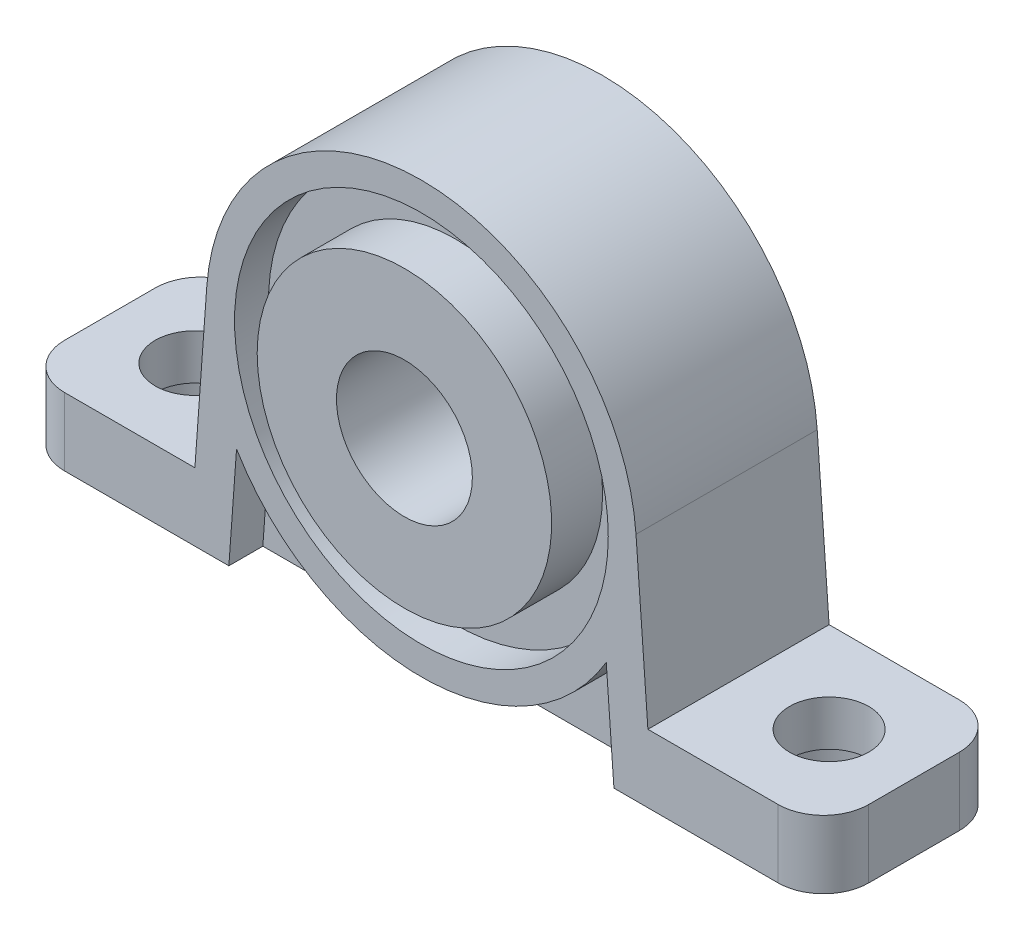
ISO-10303-21;
HEADER;
FILE_DESCRIPTION(('STEP AP214'),'2;1');
FILE_NAME('part.step','',(''),(''),'','','');
FILE_SCHEMA(('AUTOMOTIVE_DESIGN { 1 0 10303 214 1 1 1 1 }'));
ENDSEC;
DATA;
#1=APPLICATION_CONTEXT('core data for automotive mechanical design processes');
#2=APPLICATION_PROTOCOL_DEFINITION('international standard','automotive_design',2000,#1);
#3=PRODUCT_CONTEXT('',#1,'mechanical');
#4=PRODUCT('Part','Part','',(#3));
#5=PRODUCT_RELATED_PRODUCT_CATEGORY('part','',(#4));
#6=PRODUCT_DEFINITION_FORMATION('','',#4);
#7=PRODUCT_DEFINITION_CONTEXT('part definition',#1,'design');
#8=PRODUCT_DEFINITION('design','',#6,#7);
#9=PRODUCT_DEFINITION_SHAPE('','',#8);
#10=(LENGTH_UNIT() NAMED_UNIT(*) SI_UNIT(.MILLI.,.METRE.));
#11=(NAMED_UNIT(*) PLANE_ANGLE_UNIT() SI_UNIT($,.RADIAN.));
#12=(NAMED_UNIT(*) SI_UNIT($,.STERADIAN.) SOLID_ANGLE_UNIT());
#13=UNCERTAINTY_MEASURE_WITH_UNIT(LENGTH_MEASURE(1.E-05),#10,'distance_accuracy_value','');
#14=(GEOMETRIC_REPRESENTATION_CONTEXT(3) GLOBAL_UNCERTAINTY_ASSIGNED_CONTEXT((#13)) GLOBAL_UNIT_ASSIGNED_CONTEXT((#10,
#11,#12)) REPRESENTATION_CONTEXT('',''));
#15=CARTESIAN_POINT('',(0.,0.,0.));
#16=DIRECTION('',(0.,0.,1.));
#17=DIRECTION('',(1.,0.,0.));
#18=AXIS2_PLACEMENT_3D('',#15,#16,#17);
#19=CARTESIAN_POINT('',(0.,3.,8.));
#20=DIRECTION('',(0.,1.,0.));
#21=DIRECTION('',(0.,0.,1.));
#22=AXIS2_PLACEMENT_3D('',#19,#20,#21);
#23=PLANE('',#22);
#24=DIRECTION('',(0.,0.,-1.));
#25=VECTOR('',#24,1.);
#26=CARTESIAN_POINT('',(35.5,3.,8.));
#27=LINE('',#26,#25);
#28=CARTESIAN_POINT('',(35.5,3.,4.));
#29=VERTEX_POINT('',#28);
#30=CARTESIAN_POINT('',(35.5,3.,-4.));
#31=VERTEX_POINT('',#30);
#32=EDGE_CURVE('E322',#29,#31,#27,.T.);
#33=ORIENTED_EDGE('',*,*,#32,.T.);
#34=CARTESIAN_POINT('',(31.5,3.,-4.));
#35=DIRECTION('',(0.,1.,0.));
#36=DIRECTION('',(0.,0.,1.));
#37=AXIS2_PLACEMENT_3D('',#34,#35,#36);
#38=CIRCLE('',#37,4.);
#39=CARTESIAN_POINT('',(31.5,3.,-8.));
#40=VERTEX_POINT('',#39);
#41=EDGE_CURVE('E342',#31,#40,#38,.T.);
#42=ORIENTED_EDGE('',*,*,#41,.T.);
#43=DIRECTION('',(1.,0.,0.));
#44=VECTOR('',#43,1.);
#45=CARTESIAN_POINT('',(0.,3.,-8.));
#46=LINE('',#45,#44);
#47=CARTESIAN_POINT('',(20.,3.,-8.));
#48=VERTEX_POINT('',#47);
#49=EDGE_CURVE('E287',#48,#40,#46,.T.);
#50=ORIENTED_EDGE('',*,*,#49,.F.);
#51=DIRECTION('',(0.,0.,-1.));
#52=VECTOR('',#51,1.);
#53=CARTESIAN_POINT('',(20.,3.,8.));
#54=LINE('',#53,#52);
#55=CARTESIAN_POINT('',(20.,3.,8.));
#56=VERTEX_POINT('',#55);
#57=EDGE_CURVE('E320',#56,#48,#54,.T.);
#58=ORIENTED_EDGE('',*,*,#57,.F.);
#59=DIRECTION('',(1.,0.,0.));
#60=VECTOR('',#59,1.);
#61=CARTESIAN_POINT('',(0.,3.,8.));
#62=LINE('',#61,#60);
#63=CARTESIAN_POINT('',(31.5,3.,8.));
#64=VERTEX_POINT('',#63);
#65=EDGE_CURVE('E264',#56,#64,#62,.T.);
#66=ORIENTED_EDGE('',*,*,#65,.T.);
#67=CARTESIAN_POINT('',(31.5,3.,4.));
#68=DIRECTION('',(0.,1.,0.));
#69=DIRECTION('',(0.,0.,1.));
#70=AXIS2_PLACEMENT_3D('',#67,#68,#69);
#71=CIRCLE('',#70,4.);
#72=EDGE_CURVE('E340',#64,#29,#71,.T.);
#73=ORIENTED_EDGE('',*,*,#72,.T.);
#74=EDGE_LOOP('',(#33,#42,#50,#58,#66,#73));
#75=FACE_BOUND('',#74,.T.);
#76=CARTESIAN_POINT('',(28.,3.,0.));
#77=DIRECTION('',(0.,1.,0.));
#78=DIRECTION('',(0.,0.,1.));
#79=AXIS2_PLACEMENT_3D('',#76,#77,#78);
#80=CIRCLE('',#79,3.5);
#81=CARTESIAN_POINT('',(28.,3.,3.5));
#82=VERTEX_POINT('',#81);
#83=EDGE_CURVE('E746',#82,#82,#80,.T.);
#84=ORIENTED_EDGE('',*,*,#83,.F.);
#85=EDGE_LOOP('',(#84));
#86=FACE_BOUND('',#85,.T.);
#87=ADVANCED_FACE('F58',(#75,#86),#23,.T.);
#88=CARTESIAN_POINT('',(28.,-1.,0.));
#89=DIRECTION('',(0.,-1.,0.));
#90=DIRECTION('',(0.,0.,-1.));
#91=AXIS2_PLACEMENT_3D('',#88,#89,#90);
#92=PLANE('',#91);
#93=CARTESIAN_POINT('',(28.,-1.,0.));
#94=DIRECTION('',(0.,1.,0.));
#95=DIRECTION('',(0.,0.,-1.));
#96=AXIS2_PLACEMENT_3D('',#93,#94,#95);
#97=CIRCLE('',#96,5.);
#98=CARTESIAN_POINT('',(28.,-1.,-5.));
#99=VERTEX_POINT('',#98);
#100=EDGE_CURVE('E755',#99,#99,#97,.T.);
#101=ORIENTED_EDGE('',*,*,#100,.F.);
#102=EDGE_LOOP('',(#101));
#103=FACE_BOUND('',#102,.T.);
#104=CARTESIAN_POINT('',(28.,-1.,0.));
#105=DIRECTION('',(0.,1.,0.));
#106=DIRECTION('',(0.,0.,-1.));
#107=AXIS2_PLACEMENT_3D('',#104,#105,#106);
#108=CIRCLE('',#107,3.5);
#109=CARTESIAN_POINT('',(28.,-1.,-3.5));
#110=VERTEX_POINT('',#109);
#111=EDGE_CURVE('E749',#110,#110,#108,.T.);
#112=ORIENTED_EDGE('',*,*,#111,.T.);
#113=EDGE_LOOP('',(#112));
#114=FACE_BOUND('',#113,.T.);
#115=ADVANCED_FACE('F451',(#103,#114),#92,.T.);
#116=CARTESIAN_POINT('',(0.,-3.,8.));
#117=DIRECTION('',(0.,1.,0.));
#118=DIRECTION('',(0.,0.,1.));
#119=AXIS2_PLACEMENT_3D('',#116,#117,#118);
#120=PLANE('',#119);
#121=DIRECTION('',(1.,0.,0.));
#122=VECTOR('',#121,1.);
#123=CARTESIAN_POINT('',(0.,-3.,-8.));
#124=LINE('',#123,#122);
#125=CARTESIAN_POINT('',(17.,-3.,-8.));
#126=VERTEX_POINT('',#125);
#127=CARTESIAN_POINT('',(31.5,-3.,-8.));
#128=VERTEX_POINT('',#127);
#129=EDGE_CURVE('E285',#126,#128,#124,.T.);
#130=ORIENTED_EDGE('',*,*,#129,.T.);
#131=CARTESIAN_POINT('',(31.5,-3.,-4.));
#132=DIRECTION('',(0.,1.,0.));
#133=DIRECTION('',(0.,0.,1.));
#134=AXIS2_PLACEMENT_3D('',#131,#132,#133);
#135=CIRCLE('',#134,4.);
#136=CARTESIAN_POINT('',(35.5,-3.,-4.));
#137=VERTEX_POINT('',#136);
#138=EDGE_CURVE('E355',#128,#137,#135,.F.);
#139=ORIENTED_EDGE('',*,*,#138,.T.);
#140=DIRECTION('',(0.,0.,-1.));
#141=VECTOR('',#140,1.);
#142=CARTESIAN_POINT('',(35.5,-3.,8.));
#143=LINE('',#142,#141);
#144=CARTESIAN_POINT('',(35.5,-3.,4.));
#145=VERTEX_POINT('',#144);
#146=EDGE_CURVE('E325',#145,#137,#143,.T.);
#147=ORIENTED_EDGE('',*,*,#146,.F.);
#148=CARTESIAN_POINT('',(31.5,-3.,4.));
#149=DIRECTION('',(0.,1.,0.));
#150=DIRECTION('',(0.,0.,1.));
#151=AXIS2_PLACEMENT_3D('',#148,#149,#150);
#152=CIRCLE('',#151,4.);
#153=CARTESIAN_POINT('',(31.5,-3.,8.));
#154=VERTEX_POINT('',#153);
#155=EDGE_CURVE('E353',#145,#154,#152,.F.);
#156=ORIENTED_EDGE('',*,*,#155,.T.);
#157=DIRECTION('',(1.,0.,0.));
#158=VECTOR('',#157,1.);
#159=CARTESIAN_POINT('',(0.,-3.,8.));
#160=LINE('',#159,#158);
#161=CARTESIAN_POINT('',(17.,-3.,8.));
#162=VERTEX_POINT('',#161);
#163=EDGE_CURVE('E261',#162,#154,#160,.T.);
#164=ORIENTED_EDGE('',*,*,#163,.F.);
#165=DIRECTION('',(0.,0.,-1.));
#166=VECTOR('',#165,1.);
#167=CARTESIAN_POINT('',(17.,-3.,8.));
#168=LINE('',#167,#166);
#169=CARTESIAN_POINT('',(17.,-3.,5.));
#170=VERTEX_POINT('',#169);
#171=EDGE_CURVE('E329',#162,#170,#168,.T.);
#172=ORIENTED_EDGE('',*,*,#171,.T.);
#173=DIRECTION('',(1.,0.,0.));
#174=VECTOR('',#173,1.);
#175=CARTESIAN_POINT('',(0.,-3.,5.));
#176=LINE('',#175,#174);
#177=CARTESIAN_POINT('',(0.,-3.,5.));
#178=VERTEX_POINT('',#177);
#179=EDGE_CURVE('E232',#178,#170,#176,.T.);
#180=ORIENTED_EDGE('',*,*,#179,.F.);
#181=DIRECTION('',(1.,0.,0.));
#182=VECTOR('',#181,1.);
#183=CARTESIAN_POINT('',(0.,-3.,5.));
#184=LINE('',#183,#182);
#185=CARTESIAN_POINT('',(-17.,-3.,5.));
#186=VERTEX_POINT('',#185);
#187=EDGE_CURVE('E249',#186,#178,#184,.T.);
#188=ORIENTED_EDGE('',*,*,#187,.F.);
#189=DIRECTION('',(0.,0.,-1.));
#190=VECTOR('',#189,1.);
#191=CARTESIAN_POINT('',(-17.,-3.,8.));
#192=LINE('',#191,#190);
#193=CARTESIAN_POINT('',(-17.,-3.,8.));
#194=VERTEX_POINT('',#193);
#195=EDGE_CURVE('E305',#194,#186,#192,.T.);
#196=ORIENTED_EDGE('',*,*,#195,.F.);
#197=DIRECTION('',(1.,0.,0.));
#198=VECTOR('',#197,1.);
#199=CARTESIAN_POINT('',(0.,-3.,8.));
#200=LINE('',#199,#198);
#201=CARTESIAN_POINT('',(-31.5,-3.,8.));
#202=VERTEX_POINT('',#201);
#203=EDGE_CURVE('E275',#202,#194,#200,.T.);
#204=ORIENTED_EDGE('',*,*,#203,.F.);
#205=CARTESIAN_POINT('',(-31.5,-3.,4.));
#206=DIRECTION('',(0.,1.,0.));
#207=DIRECTION('',(0.,0.,1.));
#208=AXIS2_PLACEMENT_3D('',#205,#206,#207);
#209=CIRCLE('',#208,4.);
#210=CARTESIAN_POINT('',(-35.5,-3.,4.));
#211=VERTEX_POINT('',#210);
#212=EDGE_CURVE('E349',#202,#211,#209,.F.);
#213=ORIENTED_EDGE('',*,*,#212,.T.);
#214=DIRECTION('',(0.,0.,-1.));
#215=VECTOR('',#214,1.);
#216=CARTESIAN_POINT('',(-35.5,-3.,8.));
#217=LINE('',#216,#215);
#218=CARTESIAN_POINT('',(-35.5,-3.,-4.));
#219=VERTEX_POINT('',#218);
#220=EDGE_CURVE('E307',#211,#219,#217,.T.);
#221=ORIENTED_EDGE('',*,*,#220,.T.);
#222=CARTESIAN_POINT('',(-31.5,-3.,-4.));
#223=DIRECTION('',(0.,1.,0.));
#224=DIRECTION('',(0.,0.,1.));
#225=AXIS2_PLACEMENT_3D('',#222,#223,#224);
#226=CIRCLE('',#225,4.);
#227=CARTESIAN_POINT('',(-31.5,-3.,-8.));
#228=VERTEX_POINT('',#227);
#229=EDGE_CURVE('E351',#219,#228,#226,.F.);
#230=ORIENTED_EDGE('',*,*,#229,.T.);
#231=DIRECTION('',(1.,0.,0.));
#232=VECTOR('',#231,1.);
#233=CARTESIAN_POINT('',(0.,-3.,-8.));
#234=LINE('',#233,#232);
#235=CARTESIAN_POINT('',(-17.,-3.,-8.));
#236=VERTEX_POINT('',#235);
#237=EDGE_CURVE('E298',#228,#236,#234,.T.);
#238=ORIENTED_EDGE('',*,*,#237,.T.);
#239=CARTESIAN_POINT('',(-17.,-3.,-5.));
#240=VERTEX_POINT('',#239);
#241=EDGE_CURVE('E222',#240,#236,#192,.T.);
#242=ORIENTED_EDGE('',*,*,#241,.F.);
#243=DIRECTION('',(1.,0.,0.));
#244=VECTOR('',#243,1.);
#245=CARTESIAN_POINT('',(0.,-3.,-5.));
#246=LINE('',#245,#244);
#247=CARTESIAN_POINT('',(0.,-3.,-5.));
#248=VERTEX_POINT('',#247);
#249=EDGE_CURVE('E206',#240,#248,#246,.T.);
#250=ORIENTED_EDGE('',*,*,#249,.T.);
#251=DIRECTION('',(1.,0.,0.));
#252=VECTOR('',#251,1.);
#253=CARTESIAN_POINT('',(0.,-3.,-5.));
#254=LINE('',#253,#252);
#255=CARTESIAN_POINT('',(17.,-3.,-5.));
#256=VERTEX_POINT('',#255);
#257=EDGE_CURVE('E219',#248,#256,#254,.T.);
#258=ORIENTED_EDGE('',*,*,#257,.T.);
#259=EDGE_CURVE('E328',#256,#126,#168,.T.);
#260=ORIENTED_EDGE('',*,*,#259,.T.);
#261=EDGE_LOOP('',(#130,#139,#147,#156,#164,#172,#180,#188,#196,#204,#213,#221,#230,#238,#242,
#250,#258,#260));
#262=FACE_BOUND('',#261,.T.);
#263=CARTESIAN_POINT('',(-28.,-3.,0.));
#264=DIRECTION('',(0.,-1.,0.));
#265=DIRECTION('',(0.,0.,-1.));
#266=AXIS2_PLACEMENT_3D('',#263,#264,#265);
#267=CIRCLE('',#266,5.);
#268=CARTESIAN_POINT('',(-28.,-3.,-5.));
#269=VERTEX_POINT('',#268);
#270=EDGE_CURVE('E764',#269,#269,#267,.T.);
#271=ORIENTED_EDGE('',*,*,#270,.F.);
#272=EDGE_LOOP('',(#271));
#273=FACE_BOUND('',#272,.T.);
#274=CARTESIAN_POINT('',(28.,-3.,0.));
#275=DIRECTION('',(0.,1.,0.));
#276=DIRECTION('',(0.,0.,-1.));
#277=AXIS2_PLACEMENT_3D('',#274,#275,#276);
#278=CIRCLE('',#277,5.);
#279=CARTESIAN_POINT('',(28.,-3.,-5.));
#280=VERTEX_POINT('',#279);
#281=EDGE_CURVE('E752',#280,#280,#278,.T.);
#282=ORIENTED_EDGE('',*,*,#281,.T.);
#283=EDGE_LOOP('',(#282));
#284=FACE_BOUND('',#283,.T.);
#285=ADVANCED_FACE('F216',(#262,#273,#284),#120,.F.);
#286=CARTESIAN_POINT('',(0.,16.,5.));
#287=DIRECTION('',(0.,0.,1.));
#288=DIRECTION('',(1.,0.,0.));
#289=AXIS2_PLACEMENT_3D('',#286,#287,#288);
#290=PLANE('',#289);
#291=CARTESIAN_POINT('',(0.,16.,5.));
#292=DIRECTION('',(0.,0.,1.));
#293=DIRECTION('',(1.,0.,0.));
#294=AXIS2_PLACEMENT_3D('',#291,#292,#293);
#295=CIRCLE('',#294,16.5);
#296=CARTESIAN_POINT('',(16.5,16.,5.));
#297=VERTEX_POINT('',#296);
#298=EDGE_CURVE('E239',#297,#297,#295,.T.);
#299=ORIENTED_EDGE('',*,*,#298,.T.);
#300=EDGE_LOOP('',(#299));
#301=FACE_BOUND('',#300,.T.);
#302=CARTESIAN_POINT('',(0.,16.,5.));
#303=DIRECTION('',(0.,0.,1.));
#304=DIRECTION('',(1.,0.,0.));
#305=AXIS2_PLACEMENT_3D('',#302,#303,#304);
#306=CIRCLE('',#305,13.);
#307=CARTESIAN_POINT('',(13.,16.,5.));
#308=VERTEX_POINT('',#307);
#309=EDGE_CURVE('E778',#308,#308,#306,.T.);
#310=ORIENTED_EDGE('',*,*,#309,.F.);
#311=EDGE_LOOP('',(#310));
#312=FACE_BOUND('',#311,.T.);
#313=ADVANCED_FACE('F558',(#301,#312),#290,.T.);
#314=CARTESIAN_POINT('',(0.,0.,-8.));
#315=DIRECTION('',(0.,0.,1.));
#316=DIRECTION('',(1.,0.,0.));
#317=AXIS2_PLACEMENT_3D('',#314,#315,#316);
#318=PLANE('',#317);
#319=ORIENTED_EDGE('',*,*,#49,.T.);
#320=DIRECTION('',(0.,1.,0.));
#321=VECTOR('',#320,1.);
#322=CARTESIAN_POINT('',(31.5,0.,-8.));
#323=LINE('',#322,#321);
#324=EDGE_CURVE('E347',#40,#128,#323,.F.);
#325=ORIENTED_EDGE('',*,*,#324,.T.);
#326=ORIENTED_EDGE('',*,*,#129,.F.);
#327=DIRECTION('',(-0.0728367346873796,0.997343877546797,0.));
#328=VECTOR('',#327,1.);
#329=CARTESIAN_POINT('',(16.6918819571585,1.21902004405653,-8.));
#330=LINE('',#329,#328);
#331=CARTESIAN_POINT('',(16.3226260667517,6.27519263507003,-8.));
#332=VERTEX_POINT('',#331);
#333=EDGE_CURVE('E281',#126,#332,#330,.T.);
#334=ORIENTED_EDGE('',*,*,#333,.T.);
#335=CARTESIAN_POINT('',(0.,16.,-8.));
#336=DIRECTION('',(0.,0.,1.));
#337=DIRECTION('',(1.,0.,0.));
#338=AXIS2_PLACEMENT_3D('',#335,#336,#337);
#339=CIRCLE('',#338,19.);
#340=CARTESIAN_POINT('',(-16.3226260667517,6.27519263507003,-8.));
#341=VERTEX_POINT('',#340);
#342=EDGE_CURVE('E251',#341,#332,#339,.T.);
#343=ORIENTED_EDGE('',*,*,#342,.F.);
#344=DIRECTION('',(0.0728367346873796,0.997343877546797,0.));
#345=VECTOR('',#344,1.);
#346=CARTESIAN_POINT('',(-16.6918819571585,1.21902004405653,-8.));
#347=LINE('',#346,#345);
#348=EDGE_CURVE('E257',#236,#341,#347,.T.);
#349=ORIENTED_EDGE('',*,*,#348,.F.);
#350=ORIENTED_EDGE('',*,*,#237,.F.);
#351=DIRECTION('',(0.,1.,0.));
#352=VECTOR('',#351,1.);
#353=CARTESIAN_POINT('',(-31.5,3.,-8.));
#354=LINE('',#353,#352);
#355=CARTESIAN_POINT('',(-31.5,3.,-8.));
#356=VERTEX_POINT('',#355);
#357=EDGE_CURVE('E344',#228,#356,#354,.T.);
#358=ORIENTED_EDGE('',*,*,#357,.T.);
#359=DIRECTION('',(1.,0.,0.));
#360=VECTOR('',#359,1.);
#361=CARTESIAN_POINT('',(0.,3.,-8.));
#362=LINE('',#361,#360);
#363=CARTESIAN_POINT('',(-20.,3.,-8.));
#364=VERTEX_POINT('',#363);
#365=EDGE_CURVE('E296',#356,#364,#362,.T.);
#366=ORIENTED_EDGE('',*,*,#365,.T.);
#367=DIRECTION('',(-0.0728367346873799,-0.997343877546797,0.));
#368=VECTOR('',#367,1.);
#369=CARTESIAN_POINT('',(-20.1118260158045,1.46878099777894,-8.));
#370=LINE('',#369,#368);
#371=CARTESIAN_POINT('',(-18.9495336733891,17.3838979590602,-8.));
#372=VERTEX_POINT('',#371);
#373=EDGE_CURVE('E293',#372,#364,#370,.T.);
#374=ORIENTED_EDGE('',*,*,#373,.F.);
#375=CARTESIAN_POINT('',(18.9495336733891,17.3838979590602,-8.));
#376=VERTEX_POINT('',#375);
#377=EDGE_CURVE('E282',#376,#372,#339,.T.);
#378=ORIENTED_EDGE('',*,*,#377,.F.);
#379=DIRECTION('',(0.0728367346873799,-0.997343877546797,0.));
#380=VECTOR('',#379,1.);
#381=CARTESIAN_POINT('',(20.1118260158045,1.46878099777894,-8.));
#382=LINE('',#381,#380);
#383=EDGE_CURVE('E290',#376,#48,#382,.T.);
#384=ORIENTED_EDGE('',*,*,#383,.T.);
#385=EDGE_LOOP('',(#319,#325,#326,#334,#343,#349,#350,#358,#366,#374,#378,#384));
#386=FACE_BOUND('',#385,.T.);
#387=CARTESIAN_POINT('',(0.,16.,-8.));
#388=DIRECTION('',(0.,0.,1.));
#389=DIRECTION('',(1.,0.,0.));
#390=AXIS2_PLACEMENT_3D('',#387,#388,#389);
#391=CIRCLE('',#390,16.5);
#392=CARTESIAN_POINT('',(16.5,16.,-8.));
#393=VERTEX_POINT('',#392);
#394=EDGE_CURVE('E784',#393,#393,#391,.T.);
#395=ORIENTED_EDGE('',*,*,#394,.T.);
#396=EDGE_LOOP('',(#395));
#397=FACE_BOUND('',#396,.T.);
#398=ADVANCED_FACE('F413',(#386,#397),#318,.F.);
#399=CARTESIAN_POINT('',(0.,16.,8.));
#400=DIRECTION('',(0.,0.,-1.));
#401=DIRECTION('',(-1.,0.,0.));
#402=AXIS2_PLACEMENT_3D('',#399,#400,#401);
#403=CYLINDRICAL_SURFACE('',#402,19.);
#404=CARTESIAN_POINT('',(0.,16.,-5.));
#405=DIRECTION('',(0.,0.,1.));
#406=DIRECTION('',(1.,0.,0.));
#407=AXIS2_PLACEMENT_3D('',#404,#405,#406);
#408=CIRCLE('',#407,19.);
#409=CARTESIAN_POINT('',(16.3226260667517,6.27519263507003,-5.));
#410=VERTEX_POINT('',#409);
#411=EDGE_CURVE('E227',#248,#410,#408,.T.);
#412=ORIENTED_EDGE('',*,*,#411,.F.);
#413=CARTESIAN_POINT('',(0.,16.,-5.));
#414=DIRECTION('',(0.,0.,1.));
#415=DIRECTION('',(1.,0.,0.));
#416=AXIS2_PLACEMENT_3D('',#413,#414,#415);
#417=CIRCLE('',#416,19.);
#418=CARTESIAN_POINT('',(-16.3226260667518,6.27519263507003,-5.));
#419=VERTEX_POINT('',#418);
#420=EDGE_CURVE('E203',#419,#248,#417,.T.);
#421=ORIENTED_EDGE('',*,*,#420,.F.);
#422=DIRECTION('',(0.,0.,-1.));
#423=VECTOR('',#422,1.);
#424=CARTESIAN_POINT('',(-16.3226260667517,6.27519263507003,8.));
#425=LINE('',#424,#423);
#426=EDGE_CURVE('E279',#419,#341,#425,.T.);
#427=ORIENTED_EDGE('',*,*,#426,.T.);
#428=ORIENTED_EDGE('',*,*,#342,.T.);
#429=DIRECTION('',(0.,0.,-1.));
#430=VECTOR('',#429,1.);
#431=CARTESIAN_POINT('',(16.3226260667517,6.27519263507003,8.));
#432=LINE('',#431,#430);
#433=EDGE_CURVE('E230',#410,#332,#432,.T.);
#434=ORIENTED_EDGE('',*,*,#433,.F.);
#435=EDGE_LOOP('',(#412,#421,#427,#428,#434));
#436=FACE_BOUND('',#435,.T.);
#437=ADVANCED_FACE('F228',(#436),#403,.T.);
#438=CARTESIAN_POINT('',(16.6918819571585,1.21902004405653,8.));
#439=DIRECTION('',(-0.997343877546797,-0.0728367346873796,0.));
#440=DIRECTION('',(0.0728367346873796,-0.997343877546797,0.));
#441=AXIS2_PLACEMENT_3D('',#438,#439,#440);
#442=PLANE('',#441);
#443=ORIENTED_EDGE('',*,*,#259,.F.);
#444=DIRECTION('',(0.0728367346873797,-0.997343877546797,0.));
#445=VECTOR('',#444,1.);
#446=CARTESIAN_POINT('',(16.6918819571585,1.21902004405653,-5.));
#447=LINE('',#446,#445);
#448=EDGE_CURVE('E210',#410,#256,#447,.T.);
#449=ORIENTED_EDGE('',*,*,#448,.F.);
#450=ORIENTED_EDGE('',*,*,#433,.T.);
#451=ORIENTED_EDGE('',*,*,#333,.F.);
#452=EDGE_LOOP('',(#443,#449,#450,#451));
#453=FACE_BOUND('',#452,.T.);
#454=ADVANCED_FACE('F438',(#453),#442,.T.);
#455=CARTESIAN_POINT('',(-16.6918819571585,1.21902004405653,8.));
#456=DIRECTION('',(-0.997343877546797,0.0728367346873796,0.));
#457=DIRECTION('',(-0.0728367346873796,-0.997343877546797,0.));
#458=AXIS2_PLACEMENT_3D('',#455,#456,#457);
#459=PLANE('',#458);
#460=DIRECTION('',(0.0728367346873788,0.997343877546797,0.));
#461=VECTOR('',#460,1.);
#462=CARTESIAN_POINT('',(-16.6918819571585,1.21902004405652,-5.));
#463=LINE('',#462,#461);
#464=EDGE_CURVE('E207',#240,#419,#463,.T.);
#465=ORIENTED_EDGE('',*,*,#464,.F.);
#466=ORIENTED_EDGE('',*,*,#241,.T.);
#467=ORIENTED_EDGE('',*,*,#348,.T.);
#468=ORIENTED_EDGE('',*,*,#426,.F.);
#469=EDGE_LOOP('',(#465,#466,#467,#468));
#470=FACE_BOUND('',#469,.T.);
#471=ADVANCED_FACE('F434',(#470),#459,.F.);
#472=CARTESIAN_POINT('',(0.,16.,5.));
#473=DIRECTION('',(0.,0.,1.));
#474=DIRECTION('',(1.,0.,0.));
#475=AXIS2_PLACEMENT_3D('',#472,#473,#474);
#476=CIRCLE('',#475,19.);
#477=CARTESIAN_POINT('',(-16.3226260667517,6.27519263507003,5.));
#478=VERTEX_POINT('',#477);
#479=EDGE_CURVE('E223',#478,#178,#476,.T.);
#480=ORIENTED_EDGE('',*,*,#479,.T.);
#481=CARTESIAN_POINT('',(0.,16.,5.));
#482=DIRECTION('',(0.,0.,1.));
#483=DIRECTION('',(1.,0.,0.));
#484=AXIS2_PLACEMENT_3D('',#481,#482,#483);
#485=CIRCLE('',#484,19.);
#486=CARTESIAN_POINT('',(16.3226260667517,6.27519263507003,5.));
#487=VERTEX_POINT('',#486);
#488=EDGE_CURVE('E236',#178,#487,#485,.T.);
#489=ORIENTED_EDGE('',*,*,#488,.T.);
#490=CARTESIAN_POINT('',(16.3226260667517,6.27519263507003,8.));
#491=VERTEX_POINT('',#490);
#492=EDGE_CURVE('E332',#491,#487,#432,.T.);
#493=ORIENTED_EDGE('',*,*,#492,.F.);
#494=CARTESIAN_POINT('',(0.,16.,8.));
#495=DIRECTION('',(0.,0.,1.));
#496=DIRECTION('',(1.,0.,0.));
#497=AXIS2_PLACEMENT_3D('',#494,#495,#496);
#498=CIRCLE('',#497,19.);
#499=CARTESIAN_POINT('',(-16.3226260667517,6.27519263507003,8.));
#500=VERTEX_POINT('',#499);
#501=EDGE_CURVE('E254',#500,#491,#498,.T.);
#502=ORIENTED_EDGE('',*,*,#501,.F.);
#503=EDGE_CURVE('E302',#500,#478,#425,.T.);
#504=ORIENTED_EDGE('',*,*,#503,.T.);
#505=EDGE_LOOP('',(#480,#489,#493,#502,#504));
#506=FACE_BOUND('',#505,.T.);
#507=ADVANCED_FACE('F388',(#506),#403,.T.);
#508=DIRECTION('',(0.0728367346873797,-0.997343877546797,0.));
#509=VECTOR('',#508,1.);
#510=CARTESIAN_POINT('',(16.6918819571585,1.21902004405653,5.));
#511=LINE('',#510,#509);
#512=EDGE_CURVE('E235',#487,#170,#511,.T.);
#513=ORIENTED_EDGE('',*,*,#512,.T.);
#514=ORIENTED_EDGE('',*,*,#171,.F.);
#515=DIRECTION('',(-0.0728367346873796,0.997343877546797,0.));
#516=VECTOR('',#515,1.);
#517=CARTESIAN_POINT('',(16.6918819571585,1.21902004405653,8.));
#518=LINE('',#517,#516);
#519=EDGE_CURVE('E256',#162,#491,#518,.T.);
#520=ORIENTED_EDGE('',*,*,#519,.T.);
#521=ORIENTED_EDGE('',*,*,#492,.T.);
#522=EDGE_LOOP('',(#513,#514,#520,#521));
#523=FACE_BOUND('',#522,.T.);
#524=ADVANCED_FACE('F392',(#523),#442,.T.);
#525=CARTESIAN_POINT('',(35.5,0.,8.));
#526=DIRECTION('',(-1.,0.,0.));
#527=DIRECTION('',(0.,0.,1.));
#528=AXIS2_PLACEMENT_3D('',#525,#526,#527);
#529=PLANE('',#528);
#530=ORIENTED_EDGE('',*,*,#146,.T.);
#531=DIRECTION('',(0.,1.,0.));
#532=VECTOR('',#531,1.);
#533=CARTESIAN_POINT('',(35.5,0.,-4.));
#534=LINE('',#533,#532);
#535=EDGE_CURVE('E337',#137,#31,#534,.T.);
#536=ORIENTED_EDGE('',*,*,#535,.T.);
#537=ORIENTED_EDGE('',*,*,#32,.F.);
#538=DIRECTION('',(0.,1.,0.));
#539=VECTOR('',#538,1.);
#540=CARTESIAN_POINT('',(35.5,-3.,4.));
#541=LINE('',#540,#539);
#542=EDGE_CURVE('E335',#29,#145,#541,.F.);
#543=ORIENTED_EDGE('',*,*,#542,.T.);
#544=EDGE_LOOP('',(#530,#536,#537,#543));
#545=FACE_BOUND('',#544,.T.);
#546=ADVANCED_FACE('F404',(#545),#529,.F.);
#547=CARTESIAN_POINT('',(20.1118260158045,1.46878099777894,8.));
#548=DIRECTION('',(0.997343877546797,0.0728367346873799,0.));
#549=DIRECTION('',(-0.0728367346873799,0.997343877546797,0.));
#550=AXIS2_PLACEMENT_3D('',#547,#548,#549);
#551=PLANE('',#550);
#552=ORIENTED_EDGE('',*,*,#383,.F.);
#553=DIRECTION('',(0.,0.,-1.));
#554=VECTOR('',#553,1.);
#555=CARTESIAN_POINT('',(18.9495336733891,17.3838979590602,8.));
#556=LINE('',#555,#554);
#557=CARTESIAN_POINT('',(18.9495336733891,17.3838979590602,8.));
#558=VERTEX_POINT('',#557);
#559=EDGE_CURVE('E318',#558,#376,#556,.T.);
#560=ORIENTED_EDGE('',*,*,#559,.F.);
#561=DIRECTION('',(0.0728367346873799,-0.997343877546797,0.));
#562=VECTOR('',#561,1.);
#563=CARTESIAN_POINT('',(20.1118260158045,1.46878099777894,8.));
#564=LINE('',#563,#562);
#565=EDGE_CURVE('E267',#558,#56,#564,.T.);
#566=ORIENTED_EDGE('',*,*,#565,.T.);
#567=ORIENTED_EDGE('',*,*,#57,.T.);
#568=EDGE_LOOP('',(#552,#560,#566,#567));
#569=FACE_BOUND('',#568,.T.);
#570=ADVANCED_FACE('F420',(#569),#551,.T.);
#571=ORIENTED_EDGE('',*,*,#377,.T.);
#572=DIRECTION('',(0.,0.,-1.));
#573=VECTOR('',#572,1.);
#574=CARTESIAN_POINT('',(-18.9495336733891,17.3838979590602,8.));
#575=LINE('',#574,#573);
#576=CARTESIAN_POINT('',(-18.9495336733891,17.3838979590602,8.));
#577=VERTEX_POINT('',#576);
#578=EDGE_CURVE('E315',#577,#372,#575,.T.);
#579=ORIENTED_EDGE('',*,*,#578,.F.);
#580=EDGE_CURVE('E258',#558,#577,#498,.T.);
#581=ORIENTED_EDGE('',*,*,#580,.F.);
#582=ORIENTED_EDGE('',*,*,#559,.T.);
#583=EDGE_LOOP('',(#571,#579,#581,#582));
#584=FACE_BOUND('',#583,.T.);
#585=ADVANCED_FACE('F425',(#584),#403,.T.);
#586=CARTESIAN_POINT('',(-20.1118260158045,1.46878099777894,8.));
#587=DIRECTION('',(0.997343877546797,-0.0728367346873799,0.));
#588=DIRECTION('',(0.0728367346873799,0.997343877546797,0.));
#589=AXIS2_PLACEMENT_3D('',#586,#587,#588);
#590=PLANE('',#589);
#591=ORIENTED_EDGE('',*,*,#373,.T.);
#592=DIRECTION('',(0.,0.,-1.));
#593=VECTOR('',#592,1.);
#594=CARTESIAN_POINT('',(-20.,3.,8.));
#595=LINE('',#594,#593);
#596=CARTESIAN_POINT('',(-20.,3.,8.));
#597=VERTEX_POINT('',#596);
#598=EDGE_CURVE('E312',#597,#364,#595,.T.);
#599=ORIENTED_EDGE('',*,*,#598,.F.);
#600=DIRECTION('',(-0.0728367346873799,-0.997343877546797,0.));
#601=VECTOR('',#600,1.);
#602=CARTESIAN_POINT('',(-20.1118260158045,1.46878099777894,8.));
#603=LINE('',#602,#601);
#604=EDGE_CURVE('E270',#577,#597,#603,.T.);
#605=ORIENTED_EDGE('',*,*,#604,.F.);
#606=ORIENTED_EDGE('',*,*,#578,.T.);
#607=EDGE_LOOP('',(#591,#599,#605,#606));
#608=FACE_BOUND('',#607,.T.);
#609=ADVANCED_FACE('F427',(#608),#590,.F.);
#610=CARTESIAN_POINT('',(0.,3.,8.));
#611=DIRECTION('',(0.,1.,0.));
#612=DIRECTION('',(0.,0.,1.));
#613=AXIS2_PLACEMENT_3D('',#610,#611,#612);
#614=PLANE('',#613);
#615=CARTESIAN_POINT('',(-28.,3.,0.));
#616=DIRECTION('',(0.,1.,0.));
#617=DIRECTION('',(0.,0.,1.));
#618=AXIS2_PLACEMENT_3D('',#615,#616,#617);
#619=CIRCLE('',#618,3.5);
#620=CARTESIAN_POINT('',(-28.,3.,3.5));
#621=VERTEX_POINT('',#620);
#622=EDGE_CURVE('E758',#621,#621,#619,.F.);
#623=ORIENTED_EDGE('',*,*,#622,.T.);
#624=EDGE_LOOP('',(#623));
#625=FACE_BOUND('',#624,.T.);
#626=ORIENTED_EDGE('',*,*,#365,.F.);
#627=CARTESIAN_POINT('',(-31.5,3.,-4.));
#628=DIRECTION('',(0.,1.,0.));
#629=DIRECTION('',(0.,0.,1.));
#630=AXIS2_PLACEMENT_3D('',#627,#628,#629);
#631=CIRCLE('',#630,4.);
#632=CARTESIAN_POINT('',(-35.5,3.,-4.));
#633=VERTEX_POINT('',#632);
#634=EDGE_CURVE('E73',#356,#633,#631,.T.);
#635=ORIENTED_EDGE('',*,*,#634,.T.);
#636=DIRECTION('',(0.,0.,-1.));
#637=VECTOR('',#636,1.);
#638=CARTESIAN_POINT('',(-35.5,3.,8.));
#639=LINE('',#638,#637);
#640=CARTESIAN_POINT('',(-35.5,3.,4.));
#641=VERTEX_POINT('',#640);
#642=EDGE_CURVE('E310',#641,#633,#639,.T.);
#643=ORIENTED_EDGE('',*,*,#642,.F.);
#644=CARTESIAN_POINT('',(-31.5,3.,4.));
#645=DIRECTION('',(0.,1.,0.));
#646=DIRECTION('',(0.,0.,1.));
#647=AXIS2_PLACEMENT_3D('',#644,#645,#646);
#648=CIRCLE('',#647,4.);
#649=CARTESIAN_POINT('',(-31.5,3.,8.));
#650=VERTEX_POINT('',#649);
#651=EDGE_CURVE('E81',#641,#650,#648,.T.);
#652=ORIENTED_EDGE('',*,*,#651,.T.);
#653=DIRECTION('',(1.,0.,0.));
#654=VECTOR('',#653,1.);
#655=CARTESIAN_POINT('',(0.,3.,8.));
#656=LINE('',#655,#654);
#657=EDGE_CURVE('E273',#650,#597,#656,.T.);
#658=ORIENTED_EDGE('',*,*,#657,.T.);
#659=ORIENTED_EDGE('',*,*,#598,.T.);
#660=EDGE_LOOP('',(#626,#635,#643,#652,#658,#659));
#661=FACE_BOUND('',#660,.T.);
#662=ADVANCED_FACE('F368',(#625,#661),#614,.T.);
#663=CARTESIAN_POINT('',(-35.5,0.,8.));
#664=DIRECTION('',(-1.,0.,0.));
#665=DIRECTION('',(0.,0.,1.));
#666=AXIS2_PLACEMENT_3D('',#663,#664,#665);
#667=PLANE('',#666);
#668=ORIENTED_EDGE('',*,*,#642,.T.);
#669=DIRECTION('',(0.,1.,0.));
#670=VECTOR('',#669,1.);
#671=CARTESIAN_POINT('',(-35.5,-3.,-4.));
#672=LINE('',#671,#670);
#673=EDGE_CURVE('E13',#633,#219,#672,.F.);
#674=ORIENTED_EDGE('',*,*,#673,.T.);
#675=ORIENTED_EDGE('',*,*,#220,.F.);
#676=DIRECTION('',(0.,1.,0.));
#677=VECTOR('',#676,1.);
#678=CARTESIAN_POINT('',(-35.5,0.,4.));
#679=LINE('',#678,#677);
#680=EDGE_CURVE('E66',#211,#641,#679,.T.);
#681=ORIENTED_EDGE('',*,*,#680,.T.);
#682=EDGE_LOOP('',(#668,#674,#675,#681));
#683=FACE_BOUND('',#682,.T.);
#684=ADVANCED_FACE('F365',(#683),#667,.T.);
#685=ORIENTED_EDGE('',*,*,#195,.T.);
#686=DIRECTION('',(0.0728367346873788,0.997343877546797,0.));
#687=VECTOR('',#686,1.);
#688=CARTESIAN_POINT('',(-16.6918819571585,1.21902004405652,5.));
#689=LINE('',#688,#687);
#690=EDGE_CURVE('E247',#186,#478,#689,.T.);
#691=ORIENTED_EDGE('',*,*,#690,.T.);
#692=ORIENTED_EDGE('',*,*,#503,.F.);
#693=DIRECTION('',(0.0728367346873796,0.997343877546797,0.));
#694=VECTOR('',#693,1.);
#695=CARTESIAN_POINT('',(-16.6918819571585,1.21902004405653,8.));
#696=LINE('',#695,#694);
#697=EDGE_CURVE('E277',#194,#500,#696,.T.);
#698=ORIENTED_EDGE('',*,*,#697,.F.);
#699=EDGE_LOOP('',(#685,#691,#692,#698));
#700=FACE_BOUND('',#699,.T.);
#701=ADVANCED_FACE('F384',(#700),#459,.F.);
#702=CARTESIAN_POINT('',(0.,0.,8.));
#703=DIRECTION('',(0.,0.,1.));
#704=DIRECTION('',(1.,0.,0.));
#705=AXIS2_PLACEMENT_3D('',#702,#703,#704);
#706=PLANE('',#705);
#707=CARTESIAN_POINT('',(0.,16.,8.));
#708=DIRECTION('',(0.,0.,1.));
#709=DIRECTION('',(1.,0.,0.));
#710=AXIS2_PLACEMENT_3D('',#707,#708,#709);
#711=CIRCLE('',#710,16.5);
#712=CARTESIAN_POINT('',(16.5,16.,8.));
#713=VERTEX_POINT('',#712);
#714=EDGE_CURVE('E788',#713,#713,#711,.T.);
#715=ORIENTED_EDGE('',*,*,#714,.F.);
#716=EDGE_LOOP('',(#715));
#717=FACE_BOUND('',#716,.T.);
#718=ORIENTED_EDGE('',*,*,#163,.T.);
#719=DIRECTION('',(0.,1.,0.));
#720=VECTOR('',#719,1.);
#721=CARTESIAN_POINT('',(31.5,3.,8.));
#722=LINE('',#721,#720);
#723=EDGE_CURVE('E359',#154,#64,#722,.T.);
#724=ORIENTED_EDGE('',*,*,#723,.T.);
#725=ORIENTED_EDGE('',*,*,#65,.F.);
#726=ORIENTED_EDGE('',*,*,#565,.F.);
#727=ORIENTED_EDGE('',*,*,#580,.T.);
#728=ORIENTED_EDGE('',*,*,#604,.T.);
#729=ORIENTED_EDGE('',*,*,#657,.F.);
#730=DIRECTION('',(0.,1.,0.));
#731=VECTOR('',#730,1.);
#732=CARTESIAN_POINT('',(-31.5,0.,8.));
#733=LINE('',#732,#731);
#734=EDGE_CURVE('E357',#650,#202,#733,.F.);
#735=ORIENTED_EDGE('',*,*,#734,.T.);
#736=ORIENTED_EDGE('',*,*,#203,.T.);
#737=ORIENTED_EDGE('',*,*,#697,.T.);
#738=ORIENTED_EDGE('',*,*,#501,.T.);
#739=ORIENTED_EDGE('',*,*,#519,.F.);
#740=EDGE_LOOP('',(#718,#724,#725,#726,#727,#728,#729,#735,#736,#737,#738,#739));
#741=FACE_BOUND('',#740,.T.);
#742=ADVANCED_FACE('F371',(#717,#741),#706,.T.);
#743=CARTESIAN_POINT('',(0.,0.,5.));
#744=DIRECTION('',(0.,0.,1.));
#745=DIRECTION('',(1.,0.,0.));
#746=AXIS2_PLACEMENT_3D('',#743,#744,#745);
#747=PLANE('',#746);
#748=ORIENTED_EDGE('',*,*,#479,.F.);
#749=ORIENTED_EDGE('',*,*,#690,.F.);
#750=ORIENTED_EDGE('',*,*,#187,.T.);
#751=EDGE_LOOP('',(#748,#749,#750));
#752=FACE_BOUND('',#751,.T.);
#753=ADVANCED_FACE('F496',(#752),#747,.T.);
#754=CARTESIAN_POINT('',(0.,0.,-5.));
#755=DIRECTION('',(0.,0.,1.));
#756=DIRECTION('',(1.,0.,0.));
#757=AXIS2_PLACEMENT_3D('',#754,#755,#756);
#758=PLANE('',#757);
#759=ORIENTED_EDGE('',*,*,#420,.T.);
#760=ORIENTED_EDGE('',*,*,#249,.F.);
#761=ORIENTED_EDGE('',*,*,#464,.T.);
#762=EDGE_LOOP('',(#759,#760,#761));
#763=FACE_BOUND('',#762,.T.);
#764=ADVANCED_FACE('F205',(#763),#758,.F.);
#765=CARTESIAN_POINT('',(0.,0.,5.));
#766=DIRECTION('',(0.,0.,1.));
#767=DIRECTION('',(1.,0.,0.));
#768=AXIS2_PLACEMENT_3D('',#765,#766,#767);
#769=PLANE('',#768);
#770=ORIENTED_EDGE('',*,*,#488,.F.);
#771=ORIENTED_EDGE('',*,*,#179,.T.);
#772=ORIENTED_EDGE('',*,*,#512,.F.);
#773=EDGE_LOOP('',(#770,#771,#772));
#774=FACE_BOUND('',#773,.T.);
#775=ADVANCED_FACE('F511',(#774),#769,.T.);
#776=CARTESIAN_POINT('',(0.,0.,-5.));
#777=DIRECTION('',(0.,0.,1.));
#778=DIRECTION('',(1.,0.,0.));
#779=AXIS2_PLACEMENT_3D('',#776,#777,#778);
#780=PLANE('',#779);
#781=ORIENTED_EDGE('',*,*,#411,.T.);
#782=ORIENTED_EDGE('',*,*,#448,.T.);
#783=ORIENTED_EDGE('',*,*,#257,.F.);
#784=EDGE_LOOP('',(#781,#782,#783));
#785=FACE_BOUND('',#784,.T.);
#786=ADVANCED_FACE('F234',(#785),#780,.F.);
#787=CARTESIAN_POINT('',(0.,16.,5.));
#788=DIRECTION('',(0.,0.,1.));
#789=DIRECTION('',(1.,0.,0.));
#790=AXIS2_PLACEMENT_3D('',#787,#788,#789);
#791=CYLINDRICAL_SURFACE('',#790,16.5);
#792=ORIENTED_EDGE('',*,*,#298,.F.);
#793=EDGE_LOOP('',(#792));
#794=FACE_BOUND('',#793,.T.);
#795=ORIENTED_EDGE('',*,*,#714,.T.);
#796=EDGE_LOOP('',(#795));
#797=FACE_BOUND('',#796,.T.);
#798=ADVANCED_FACE('F529',(#794,#797),#791,.F.);
#799=CARTESIAN_POINT('',(0.,16.,-5.));
#800=DIRECTION('',(0.,0.,-1.));
#801=DIRECTION('',(-1.,0.,0.));
#802=AXIS2_PLACEMENT_3D('',#799,#800,#801);
#803=CYLINDRICAL_SURFACE('',#802,16.5);
#804=CARTESIAN_POINT('',(0.,16.,-5.));
#805=DIRECTION('',(0.,0.,1.));
#806=DIRECTION('',(1.,0.,0.));
#807=AXIS2_PLACEMENT_3D('',#804,#805,#806);
#808=CIRCLE('',#807,16.5);
#809=CARTESIAN_POINT('',(16.5,16.,-5.));
#810=VERTEX_POINT('',#809);
#811=EDGE_CURVE('E785',#810,#810,#808,.T.);
#812=ORIENTED_EDGE('',*,*,#811,.T.);
#813=EDGE_LOOP('',(#812));
#814=FACE_BOUND('',#813,.T.);
#815=ORIENTED_EDGE('',*,*,#394,.F.);
#816=EDGE_LOOP('',(#815));
#817=FACE_BOUND('',#816,.T.);
#818=ADVANCED_FACE('F538',(#814,#817),#803,.F.);
#819=CARTESIAN_POINT('',(0.,16.,-5.));
#820=DIRECTION('',(0.,0.,-1.));
#821=DIRECTION('',(1.,0.,0.));
#822=AXIS2_PLACEMENT_3D('',#819,#820,#821);
#823=PLANE('',#822);
#824=CARTESIAN_POINT('',(0.,16.,-5.));
#825=DIRECTION('',(0.,0.,-1.));
#826=DIRECTION('',(-1.,0.,0.));
#827=AXIS2_PLACEMENT_3D('',#824,#825,#826);
#828=CIRCLE('',#827,6.);
#829=CARTESIAN_POINT('',(-6.,16.,-5.));
#830=VERTEX_POINT('',#829);
#831=EDGE_CURVE('E775',#830,#830,#828,.T.);
#832=ORIENTED_EDGE('',*,*,#831,.F.);
#833=EDGE_LOOP('',(#832));
#834=FACE_BOUND('',#833,.T.);
#835=ORIENTED_EDGE('',*,*,#811,.F.);
#836=EDGE_LOOP('',(#835));
#837=FACE_BOUND('',#836,.T.);
#838=ADVANCED_FACE('F549',(#834,#837),#823,.T.);
#839=CARTESIAN_POINT('',(0.,16.,60.7695526217005));
#840=DIRECTION('',(0.,0.,-1.));
#841=DIRECTION('',(-1.,0.,0.));
#842=AXIS2_PLACEMENT_3D('',#839,#840,#841);
#843=CYLINDRICAL_SURFACE('',#842,13.);
#844=CARTESIAN_POINT('',(0.,16.,9.5));
#845=DIRECTION('',(0.,0.,-1.));
#846=DIRECTION('',(-1.,0.,0.));
#847=AXIS2_PLACEMENT_3D('',#844,#845,#846);
#848=CIRCLE('',#847,13.);
#849=CARTESIAN_POINT('',(-13.,16.,9.5));
#850=VERTEX_POINT('',#849);
#851=EDGE_CURVE('E781',#850,#850,#848,.T.);
#852=ORIENTED_EDGE('',*,*,#851,.T.);
#853=EDGE_LOOP('',(#852));
#854=FACE_BOUND('',#853,.T.);
#855=ORIENTED_EDGE('',*,*,#309,.T.);
#856=EDGE_LOOP('',(#855));
#857=FACE_BOUND('',#856,.T.);
#858=ADVANCED_FACE('F571',(#854,#857),#843,.T.);
#859=CARTESIAN_POINT('',(0.,16.,9.5));
#860=DIRECTION('',(0.,0.,-1.));
#861=DIRECTION('',(1.,0.,0.));
#862=AXIS2_PLACEMENT_3D('',#859,#860,#861);
#863=PLANE('',#862);
#864=CARTESIAN_POINT('',(0.,16.,9.5));
#865=DIRECTION('',(0.,0.,1.));
#866=DIRECTION('',(1.,0.,0.));
#867=AXIS2_PLACEMENT_3D('',#864,#865,#866);
#868=CIRCLE('',#867,6.);
#869=CARTESIAN_POINT('',(6.,16.,9.5));
#870=VERTEX_POINT('',#869);
#871=EDGE_CURVE('E770',#870,#870,#868,.T.);
#872=ORIENTED_EDGE('',*,*,#871,.F.);
#873=EDGE_LOOP('',(#872));
#874=FACE_BOUND('',#873,.T.);
#875=ORIENTED_EDGE('',*,*,#851,.F.);
#876=EDGE_LOOP('',(#875));
#877=FACE_BOUND('',#876,.T.);
#878=ADVANCED_FACE('F575',(#874,#877),#863,.F.);
#879=CARTESIAN_POINT('',(0.,16.,-8.));
#880=DIRECTION('',(0.,0.,1.));
#881=DIRECTION('',(1.,0.,0.));
#882=AXIS2_PLACEMENT_3D('',#879,#880,#881);
#883=CYLINDRICAL_SURFACE('',#882,6.);
#884=ORIENTED_EDGE('',*,*,#831,.T.);
#885=EDGE_LOOP('',(#884));
#886=FACE_BOUND('',#885,.T.);
#887=ORIENTED_EDGE('',*,*,#871,.T.);
#888=EDGE_LOOP('',(#887));
#889=FACE_BOUND('',#888,.T.);
#890=ADVANCED_FACE('F592',(#886,#889),#883,.F.);
#891=CARTESIAN_POINT('',(31.5,0.,-4.));
#892=DIRECTION('',(0.,1.,0.));
#893=DIRECTION('',(0.,0.,1.));
#894=AXIS2_PLACEMENT_3D('',#891,#892,#893);
#895=CYLINDRICAL_SURFACE('',#894,4.);
#896=ORIENTED_EDGE('',*,*,#138,.F.);
#897=ORIENTED_EDGE('',*,*,#324,.F.);
#898=ORIENTED_EDGE('',*,*,#41,.F.);
#899=ORIENTED_EDGE('',*,*,#535,.F.);
#900=EDGE_LOOP('',(#896,#897,#898,#899));
#901=FACE_BOUND('',#900,.T.);
#902=ADVANCED_FACE('F409',(#901),#895,.T.);
#903=CARTESIAN_POINT('',(31.5,0.,4.));
#904=DIRECTION('',(0.,-1.,0.));
#905=DIRECTION('',(0.,0.,-1.));
#906=AXIS2_PLACEMENT_3D('',#903,#904,#905);
#907=CYLINDRICAL_SURFACE('',#906,4.);
#908=ORIENTED_EDGE('',*,*,#155,.F.);
#909=ORIENTED_EDGE('',*,*,#542,.F.);
#910=ORIENTED_EDGE('',*,*,#72,.F.);
#911=ORIENTED_EDGE('',*,*,#723,.F.);
#912=EDGE_LOOP('',(#908,#909,#910,#911));
#913=FACE_BOUND('',#912,.T.);
#914=ADVANCED_FACE('F398',(#913),#907,.T.);
#915=CARTESIAN_POINT('',(-31.5,0.,-4.));
#916=DIRECTION('',(0.,-1.,0.));
#917=DIRECTION('',(0.,0.,-1.));
#918=AXIS2_PLACEMENT_3D('',#915,#916,#917);
#919=CYLINDRICAL_SURFACE('',#918,4.);
#920=ORIENTED_EDGE('',*,*,#229,.F.);
#921=ORIENTED_EDGE('',*,*,#673,.F.);
#922=ORIENTED_EDGE('',*,*,#634,.F.);
#923=ORIENTED_EDGE('',*,*,#357,.F.);
#924=EDGE_LOOP('',(#920,#921,#922,#923));
#925=FACE_BOUND('',#924,.T.);
#926=ADVANCED_FACE('F432',(#925),#919,.T.);
#927=CARTESIAN_POINT('',(-31.5,0.,4.));
#928=DIRECTION('',(0.,1.,0.));
#929=DIRECTION('',(0.,0.,1.));
#930=AXIS2_PLACEMENT_3D('',#927,#928,#929);
#931=CYLINDRICAL_SURFACE('',#930,4.);
#932=ORIENTED_EDGE('',*,*,#212,.F.);
#933=ORIENTED_EDGE('',*,*,#734,.F.);
#934=ORIENTED_EDGE('',*,*,#651,.F.);
#935=ORIENTED_EDGE('',*,*,#680,.F.);
#936=EDGE_LOOP('',(#932,#933,#934,#935));
#937=FACE_BOUND('',#936,.T.);
#938=ADVANCED_FACE('F60',(#937),#931,.T.);
#939=CARTESIAN_POINT('',(-28.,-1.,0.));
#940=DIRECTION('',(0.,-1.,0.));
#941=DIRECTION('',(0.,0.,-1.));
#942=AXIS2_PLACEMENT_3D('',#939,#940,#941);
#943=CYLINDRICAL_SURFACE('',#942,5.);
#944=CARTESIAN_POINT('',(-28.,-1.,0.));
#945=DIRECTION('',(0.,-1.,0.));
#946=DIRECTION('',(0.,0.,-1.));
#947=AXIS2_PLACEMENT_3D('',#944,#945,#946);
#948=CIRCLE('',#947,5.);
#949=CARTESIAN_POINT('',(-28.,-1.,-5.));
#950=VERTEX_POINT('',#949);
#951=EDGE_CURVE('E767',#950,#950,#948,.T.);
#952=ORIENTED_EDGE('',*,*,#951,.F.);
#953=EDGE_LOOP('',(#952));
#954=FACE_BOUND('',#953,.T.);
#955=ORIENTED_EDGE('',*,*,#270,.T.);
#956=EDGE_LOOP('',(#955));
#957=FACE_BOUND('',#956,.T.);
#958=ADVANCED_FACE('F663',(#954,#957),#943,.F.);
#959=CARTESIAN_POINT('',(-28.,-1.,0.));
#960=DIRECTION('',(0.,-1.,0.));
#961=DIRECTION('',(0.,0.,-1.));
#962=AXIS2_PLACEMENT_3D('',#959,#960,#961);
#963=PLANE('',#962);
#964=CARTESIAN_POINT('',(-28.,-1.,0.));
#965=DIRECTION('',(0.,-1.,0.));
#966=DIRECTION('',(0.,0.,-1.));
#967=AXIS2_PLACEMENT_3D('',#964,#965,#966);
#968=CIRCLE('',#967,3.5);
#969=CARTESIAN_POINT('',(-28.,-1.,-3.5));
#970=VERTEX_POINT('',#969);
#971=EDGE_CURVE('E761',#970,#970,#968,.T.);
#972=ORIENTED_EDGE('',*,*,#971,.F.);
#973=EDGE_LOOP('',(#972));
#974=FACE_BOUND('',#973,.T.);
#975=ORIENTED_EDGE('',*,*,#951,.T.);
#976=EDGE_LOOP('',(#975));
#977=FACE_BOUND('',#976,.T.);
#978=ADVANCED_FACE('F671',(#974,#977),#963,.T.);
#979=CARTESIAN_POINT('',(-28.,35.001,0.));
#980=DIRECTION('',(0.,-1.,0.));
#981=DIRECTION('',(0.,0.,-1.));
#982=AXIS2_PLACEMENT_3D('',#979,#980,#981);
#983=CYLINDRICAL_SURFACE('',#982,3.5);
#984=ORIENTED_EDGE('',*,*,#622,.F.);
#985=EDGE_LOOP('',(#984));
#986=FACE_BOUND('',#985,.T.);
#987=ORIENTED_EDGE('',*,*,#971,.T.);
#988=EDGE_LOOP('',(#987));
#989=FACE_BOUND('',#988,.T.);
#990=ADVANCED_FACE('F689',(#986,#989),#983,.F.);
#991=CARTESIAN_POINT('',(28.,-1.,0.));
#992=DIRECTION('',(0.,-1.,0.));
#993=DIRECTION('',(0.,0.,-1.));
#994=AXIS2_PLACEMENT_3D('',#991,#992,#993);
#995=CYLINDRICAL_SURFACE('',#994,5.);
#996=ORIENTED_EDGE('',*,*,#100,.T.);
#997=EDGE_LOOP('',(#996));
#998=FACE_BOUND('',#997,.T.);
#999=ORIENTED_EDGE('',*,*,#281,.F.);
#1000=EDGE_LOOP('',(#999));
#1001=FACE_BOUND('',#1000,.T.);
#1002=ADVANCED_FACE('F698',(#998,#1001),#995,.F.);
#1003=CARTESIAN_POINT('',(28.,35.001,0.));
#1004=DIRECTION('',(0.,-1.,0.));
#1005=DIRECTION('',(0.,0.,-1.));
#1006=AXIS2_PLACEMENT_3D('',#1003,#1004,#1005);
#1007=CYLINDRICAL_SURFACE('',#1006,3.5);
#1008=ORIENTED_EDGE('',*,*,#83,.T.);
#1009=EDGE_LOOP('',(#1008));
#1010=FACE_BOUND('',#1009,.T.);
#1011=ORIENTED_EDGE('',*,*,#111,.F.);
#1012=EDGE_LOOP('',(#1011));
#1013=FACE_BOUND('',#1012,.T.);
#1014=ADVANCED_FACE('F730',(#1010,#1013),#1007,.F.);
#1015=CLOSED_SHELL('',(#87,#115,#285,#313,#398,#437,#454,#471,#507,#524,#546,#570,#585,#609,
#662,#684,#701,#742,#753,#764,#775,#786,#798,#818,#838,#858,#878,#890,#902,#914,#926,#938,#958,
#978,#990,#1002,#1014));
#1016=MANIFOLD_SOLID_BREP('B2',#1015);
#1017=ADVANCED_BREP_SHAPE_REPRESENTATION('',(#18,#1016),#14);
#1018=SHAPE_DEFINITION_REPRESENTATION(#9,#1017);
ENDSEC;
END-ISO-10303-21;
